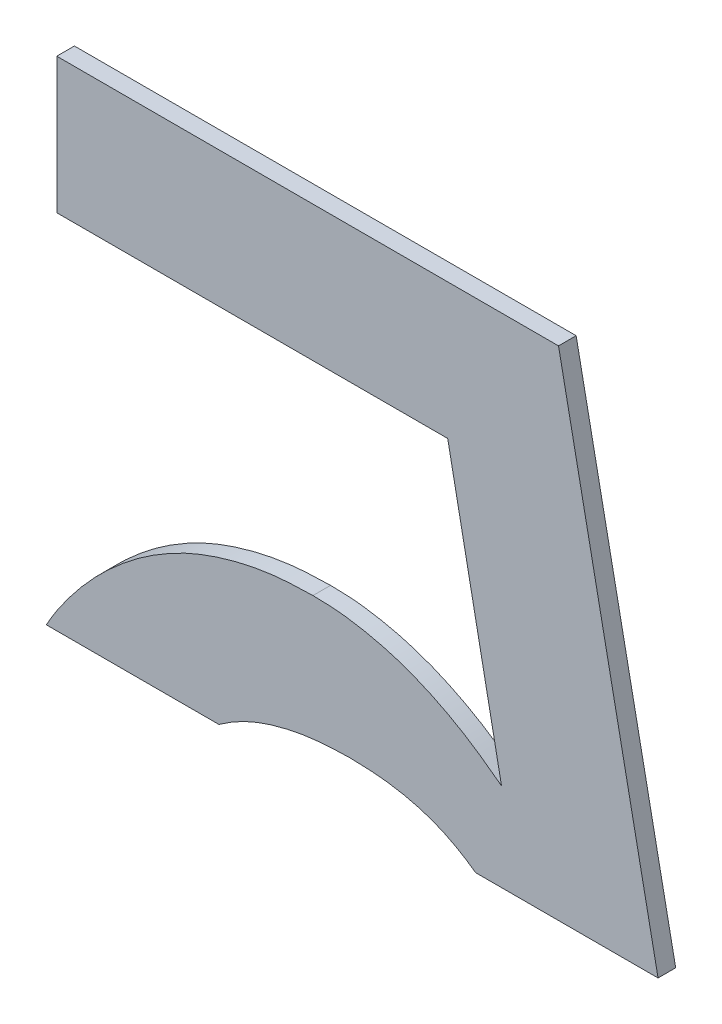
ISO-10303-21;
HEADER;
FILE_DESCRIPTION(('STEP AP214'),'2;1');
FILE_NAME('part.step','',(''),(''),'','','');
FILE_SCHEMA(('AUTOMOTIVE_DESIGN { 1 0 10303 214 1 1 1 1 }'));
ENDSEC;
DATA;
#1=APPLICATION_CONTEXT('core data for automotive mechanical design processes');
#2=APPLICATION_PROTOCOL_DEFINITION('international standard','automotive_design',2000,#1);
#3=PRODUCT_CONTEXT('',#1,'mechanical');
#4=PRODUCT('Part','Part','',(#3));
#5=PRODUCT_RELATED_PRODUCT_CATEGORY('part','',(#4));
#6=PRODUCT_DEFINITION_FORMATION('','',#4);
#7=PRODUCT_DEFINITION_CONTEXT('part definition',#1,'design');
#8=PRODUCT_DEFINITION('design','',#6,#7);
#9=PRODUCT_DEFINITION_SHAPE('','',#8);
#10=(LENGTH_UNIT() NAMED_UNIT(*) SI_UNIT(.MILLI.,.METRE.));
#11=(NAMED_UNIT(*) PLANE_ANGLE_UNIT() SI_UNIT($,.RADIAN.));
#12=(NAMED_UNIT(*) SI_UNIT($,.STERADIAN.) SOLID_ANGLE_UNIT());
#13=UNCERTAINTY_MEASURE_WITH_UNIT(LENGTH_MEASURE(1.E-05),#10,'distance_accuracy_value','');
#14=(GEOMETRIC_REPRESENTATION_CONTEXT(3) GLOBAL_UNCERTAINTY_ASSIGNED_CONTEXT((#13)) GLOBAL_UNIT_ASSIGNED_CONTEXT((#10,
#11,#12)) REPRESENTATION_CONTEXT('',''));
#15=CARTESIAN_POINT('',(0.,0.,0.));
#16=DIRECTION('',(0.,0.,1.));
#17=DIRECTION('',(1.,0.,0.));
#18=AXIS2_PLACEMENT_3D('',#15,#16,#17);
#19=CARTESIAN_POINT('',(-5.76923076923075,-4.93990384615385,0.5));
#20=CARTESIAN_POINT('',(-5.76481556671325,-4.69534295230196,0.5));
#21=CARTESIAN_POINT('',(-5.75621814341022,-4.21912617187611,0.5));
#22=CARTESIAN_POINT('',(-5.68381381272763,-3.52567536035832,0.5));
#23=CARTESIAN_POINT('',(-5.56165918279042,-2.87362173974889,0.5));
#24=CARTESIAN_POINT('',(-5.40360252933254,-2.25577854103315,0.5));
#25=CARTESIAN_POINT('',(-5.18574136819858,-1.68180032511622,0.5));
#26=CARTESIAN_POINT('',(-4.92734576377249,-1.14336496905831,0.5));
#27=CARTESIAN_POINT('',(-4.61080028837524,-0.651899656303548,0.5));
#28=CARTESIAN_POINT('',(-4.25862255894378,-0.192101936840787,0.5));
#29=CARTESIAN_POINT('',(-3.85639112961883,0.220088191438074,0.5));
#30=CARTESIAN_POINT('',(-3.39867192137992,0.568130547046922,0.5));
#31=CARTESIAN_POINT('',(-2.9034209885128,0.872737896042509,0.5));
#32=CARTESIAN_POINT('',(-2.3606634698756,1.11975545357985,0.5));
#33=CARTESIAN_POINT('',(-1.77007976351094,1.30328021662253,0.5));
#34=CARTESIAN_POINT('',(-1.13753864408726,1.44448600800401,0.5));
#35=CARTESIAN_POINT('',(-0.456476560536233,1.51875447221429,0.5));
#36=CARTESIAN_POINT('',(0.0118653544143888,1.53177450360067,0.5));
#37=CARTESIAN_POINT('',(0.252403846153862,1.53846153846154,0.5));
#38=B_SPLINE_CURVE_WITH_KNOTS('',3,(#19,#20,#21,#22,#23,#24,#25,#26,#27,#28,#29,#30,#31,#32,#33,
#34,#35,#36,#37),.UNSPECIFIED.,.F.,.F.,(4,1,1,1,1,1,1,1,1,1,1,1,1,1,1,1,4),(0.,
0.0728659334565352,0.141886871964126,0.207452626414711,0.270437680000097,0.331640872247669,
0.390107577493158,0.448069286948836,0.505502951924537,0.562488152833724,0.619084328884729,
0.676415530692239,0.735452360450793,0.796240769448678,0.860405678089203,0.928304927285106,1.),.UNSPECIFIED.);
#39=DIRECTION('',(0.,0.,-1.));
#40=VECTOR('',#39,1.);
#41=SURFACE_OF_LINEAR_EXTRUSION('',#38,#40);
#42=CARTESIAN_POINT('',(-3.47966020913503,0.500000002167179,0.5));
#43=VERTEX_POINT('',#42);
#44=CARTESIAN_POINT('',(0.252403846153862,1.53846153846154,0.5));
#45=VERTEX_POINT('',#44);
#46=EDGE_CURVE('E169',#43,#45,#38,.T.);
#47=ORIENTED_EDGE('',*,*,#46,.F.);
#48=DIRECTION('',(0.,0.,-1.));
#49=VECTOR('',#48,1.);
#50=CARTESIAN_POINT('',(-3.47966021217343,0.5,0.5));
#51=LINE('',#50,#49);
#52=CARTESIAN_POINT('',(-3.47966021217346,0.5,0.));
#53=VERTEX_POINT('',#52);
#54=EDGE_CURVE('E54',#43,#53,#51,.T.);
#55=ORIENTED_EDGE('',*,*,#54,.T.);
#56=CARTESIAN_POINT('',(-5.76923076923075,-4.93990384615385,0.));
#57=CARTESIAN_POINT('',(-5.76481556671325,-4.69534295230196,0.));
#58=CARTESIAN_POINT('',(-5.75621814341022,-4.21912617187611,0.));
#59=CARTESIAN_POINT('',(-5.68381381272763,-3.52567536035832,0.));
#60=CARTESIAN_POINT('',(-5.56165918279042,-2.87362173974889,0.));
#61=CARTESIAN_POINT('',(-5.40360252933254,-2.25577854103315,0.));
#62=CARTESIAN_POINT('',(-5.18574136819858,-1.68180032511622,0.));
#63=CARTESIAN_POINT('',(-4.92734576377249,-1.14336496905831,0.));
#64=CARTESIAN_POINT('',(-4.61080028837524,-0.651899656303548,0.));
#65=CARTESIAN_POINT('',(-4.25862255894378,-0.192101936840787,0.));
#66=CARTESIAN_POINT('',(-3.85639112961883,0.220088191438074,0.));
#67=CARTESIAN_POINT('',(-3.39867192137992,0.568130547046922,0.));
#68=CARTESIAN_POINT('',(-2.9034209885128,0.872737896042509,0.));
#69=CARTESIAN_POINT('',(-2.3606634698756,1.11975545357985,0.));
#70=CARTESIAN_POINT('',(-1.77007976351094,1.30328021662253,0.));
#71=CARTESIAN_POINT('',(-1.13753864408726,1.44448600800401,0.));
#72=CARTESIAN_POINT('',(-0.456476560536233,1.51875447221429,0.));
#73=CARTESIAN_POINT('',(0.0118653544143888,1.53177450360067,0.));
#74=CARTESIAN_POINT('',(0.252403846153862,1.53846153846154,0.));
#75=B_SPLINE_CURVE_WITH_KNOTS('',3,(#56,#57,#58,#59,#60,#61,#62,#63,#64,#65,#66,#67,#68,#69,#70,
#71,#72,#73,#74),.UNSPECIFIED.,.F.,.F.,(4,1,1,1,1,1,1,1,1,1,1,1,1,1,1,1,4),(0.,
0.0728659334565352,0.141886871964126,0.207452626414711,0.270437680000097,0.331640872247669,
0.390107577493158,0.448069286948836,0.505502951924537,0.562488152833724,0.619084328884729,
0.676415530692239,0.735452360450793,0.796240769448678,0.860405678089203,0.928304927285106,1.),.UNSPECIFIED.);
#76=CARTESIAN_POINT('',(0.252403846153862,1.53846153846154,0.));
#77=VERTEX_POINT('',#76);
#78=EDGE_CURVE('E158',#53,#77,#75,.T.);
#79=ORIENTED_EDGE('',*,*,#78,.T.);
#80=DIRECTION('',(0.,0.,-1.));
#81=VECTOR('',#80,1.);
#82=CARTESIAN_POINT('',(0.252403846153862,1.53846153846154,0.5));
#83=LINE('',#82,#81);
#84=EDGE_CURVE('E130',#45,#77,#83,.T.);
#85=ORIENTED_EDGE('',*,*,#84,.F.);
#86=EDGE_LOOP('',(#47,#55,#79,#85));
#87=FACE_BOUND('',#86,.T.);
#88=ADVANCED_FACE('F39',(#87),#41,.F.);
#89=CARTESIAN_POINT('',(0.252403846153862,1.53846153846154,0.5));
#90=CARTESIAN_POINT('',(0.551501787921143,1.52971233904579,0.5));
#91=CARTESIAN_POINT('',(1.12510395300073,1.51293335455016,0.5));
#92=CARTESIAN_POINT('',(1.94931127775644,1.37177777436305,0.5));
#93=CARTESIAN_POINT('',(2.6996170459154,1.14375891607494,0.5));
#94=CARTESIAN_POINT('',(3.36752632179783,0.803924548647301,0.5));
#95=CARTESIAN_POINT('',(3.96427025562259,0.397936577027731,0.5));
#96=CARTESIAN_POINT('',(4.5022458815372,-0.0614572307281851,0.5));
#97=CARTESIAN_POINT('',(4.98588935496152,-0.573946283867243,0.5));
#98=CARTESIAN_POINT('',(5.2511874903316,-0.959791056380103,0.5));
#99=CARTESIAN_POINT('',(5.3846153846154,-1.15384615384615,0.5));
#100=B_SPLINE_CURVE_WITH_KNOTS('',3,(#89,#90,#91,#92,#93,#94,#95,#96,#97,#98,#99),.UNSPECIFIED.,
.F.,.F.,(4,1,1,1,1,1,1,1,4),(0.,0.147859636731253,0.283561321939548,0.412369396138531,
0.534236355887945,0.652691629311983,0.768663059498123,0.883652401860404,1.),.UNSPECIFIED.);
#101=DIRECTION('',(0.,0.,-1.));
#102=VECTOR('',#101,1.);
#103=SURFACE_OF_LINEAR_EXTRUSION('',#100,#102);
#104=CARTESIAN_POINT('',(0.252403846153862,1.53846153846154,0.));
#105=CARTESIAN_POINT('',(0.551501787921143,1.52971233904579,0.));
#106=CARTESIAN_POINT('',(1.12510395300073,1.51293335455016,0.));
#107=CARTESIAN_POINT('',(1.94931127775644,1.37177777436305,0.));
#108=CARTESIAN_POINT('',(2.6996170459154,1.14375891607494,0.));
#109=CARTESIAN_POINT('',(3.36752632179783,0.803924548647301,0.));
#110=CARTESIAN_POINT('',(3.96427025562259,0.397936577027731,0.));
#111=CARTESIAN_POINT('',(4.5022458815372,-0.0614572307281851,0.));
#112=CARTESIAN_POINT('',(4.98588935496152,-0.573946283867243,0.));
#113=CARTESIAN_POINT('',(5.2511874903316,-0.959791056380103,0.));
#114=CARTESIAN_POINT('',(5.3846153846154,-1.15384615384615,0.));
#115=B_SPLINE_CURVE_WITH_KNOTS('',3,(#104,#105,#106,#107,#108,#109,#110,#111,#112,#113,#114),
.UNSPECIFIED.,.F.,.F.,(4,1,1,1,1,1,1,1,4),(0.,0.147859636731253,0.283561321939548,
0.412369396138531,0.534236355887945,0.652691629311983,0.768663059498123,0.883652401860404,1.),.UNSPECIFIED.);
#116=CARTESIAN_POINT('',(3.80457211909477,0.500000000032833,0.));
#117=VERTEX_POINT('',#116);
#118=EDGE_CURVE('E151',#77,#117,#115,.T.);
#119=ORIENTED_EDGE('',*,*,#118,.T.);
#120=DIRECTION('',(0.,0.,-1.));
#121=VECTOR('',#120,1.);
#122=CARTESIAN_POINT('',(3.80457211914053,0.500000000000002,0.5));
#123=LINE('',#122,#121);
#124=CARTESIAN_POINT('',(3.80457213180867,0.5,0.5));
#125=VERTEX_POINT('',#124);
#126=EDGE_CURVE('E159',#117,#125,#123,.F.);
#127=ORIENTED_EDGE('',*,*,#126,.T.);
#128=EDGE_CURVE('E136',#45,#125,#100,.T.);
#129=ORIENTED_EDGE('',*,*,#128,.F.);
#130=ORIENTED_EDGE('',*,*,#84,.T.);
#131=EDGE_LOOP('',(#119,#127,#129,#130));
#132=FACE_BOUND('',#131,.T.);
#133=ADVANCED_FACE('F184',(#132),#103,.F.);
#134=CARTESIAN_POINT('',(9.23076923076925,-0.76923076923077,0.5));
#135=DIRECTION('',(-0.98058067569092,-0.196116135138184,0.));
#136=DIRECTION('',(0.196116135138184,-0.98058067569092,0.));
#137=AXIS2_PLACEMENT_3D('',#134,#135,#136);
#138=PLANE('',#137);
#139=DIRECTION('',(-0.196116135138184,0.98058067569092,0.));
#140=VECTOR('',#139,1.);
#141=CARTESIAN_POINT('',(9.23076923076925,-0.76923076923077,0.5));
#142=LINE('',#141,#140);
#143=CARTESIAN_POINT('',(8.97692307692309,0.5,0.5));
#144=VERTEX_POINT('',#143);
#145=CARTESIAN_POINT('',(6.15384615384617,14.6153846153846,0.5));
#146=VERTEX_POINT('',#145);
#147=EDGE_CURVE('E133',#144,#146,#142,.T.);
#148=ORIENTED_EDGE('',*,*,#147,.F.);
#149=DIRECTION('',(0.,0.,-1.));
#150=VECTOR('',#149,1.);
#151=CARTESIAN_POINT('',(8.97692307692309,0.5,0.5));
#152=LINE('',#151,#150);
#153=CARTESIAN_POINT('',(8.97692307692309,0.5,0.));
#154=VERTEX_POINT('',#153);
#155=EDGE_CURVE('E120',#144,#154,#152,.T.);
#156=ORIENTED_EDGE('',*,*,#155,.T.);
#157=DIRECTION('',(-0.196116135138184,0.98058067569092,0.));
#158=VECTOR('',#157,1.);
#159=CARTESIAN_POINT('',(9.23076923076925,-0.76923076923077,0.));
#160=LINE('',#159,#158);
#161=CARTESIAN_POINT('',(6.15384615384617,14.6153846153846,0.));
#162=VERTEX_POINT('',#161);
#163=EDGE_CURVE('E128',#154,#162,#160,.T.);
#164=ORIENTED_EDGE('',*,*,#163,.T.);
#165=DIRECTION('',(0.,0.,-1.));
#166=VECTOR('',#165,1.);
#167=CARTESIAN_POINT('',(6.15384615384617,14.6153846153846,0.5));
#168=LINE('',#167,#166);
#169=EDGE_CURVE('E141',#146,#162,#168,.T.);
#170=ORIENTED_EDGE('',*,*,#169,.F.);
#171=EDGE_LOOP('',(#148,#156,#164,#170));
#172=FACE_BOUND('',#171,.T.);
#173=ADVANCED_FACE('F137',(#172),#138,.F.);
#174=CARTESIAN_POINT('',(-0.81129807692306,5.,0.5));
#175=CARTESIAN_POINT('',(-1.1141988645718,4.99206375907898,0.5));
#176=CARTESIAN_POINT('',(-1.71068397645657,4.9764353759689,0.5));
#177=CARTESIAN_POINT('',(-2.58962544260301,4.8480285306234,0.5));
#178=CARTESIAN_POINT('',(-3.43004133811339,4.63004939817371,0.5));
#179=CARTESIAN_POINT('',(-4.2385238149774,4.336463286216,0.5));
#180=CARTESIAN_POINT('',(-5.00441208821668,3.94726474256061,0.5));
#181=CARTESIAN_POINT('',(-5.73546405515526,3.47602794776569,0.5));
#182=CARTESIAN_POINT('',(-6.42872820607369,2.91886862879422,0.5));
#183=CARTESIAN_POINT('',(-7.08028531926996,2.2862992321744,0.5));
#184=CARTESIAN_POINT('',(-7.67127353299072,1.58408070090461,0.5));
#185=CARTESIAN_POINT('',(-8.20022727277801,0.835114931584709,0.5));
#186=CARTESIAN_POINT('',(-8.63224779451468,0.0244096904560783,0.5));
#187=CARTESIAN_POINT('',(-8.99560670429197,-0.826867370101214,0.5));
#188=CARTESIAN_POINT('',(-9.26965977427216,-1.73269027221245,0.5));
#189=CARTESIAN_POINT('',(-9.477675619546,-2.68020353887867,0.5));
#190=CARTESIAN_POINT('',(-9.58889478622745,-3.68125324903562,0.5));
#191=CARTESIAN_POINT('',(-9.60641647528384,-4.36273507459891,0.5));
#192=CARTESIAN_POINT('',(-9.6153846153846,-4.71153846153846,0.5));
#193=B_SPLINE_CURVE_WITH_KNOTS('',3,(#174,#175,#176,#177,#178,#179,#180,#181,#182,#183,#184,
#185,#186,#187,#188,#189,#190,#191,#192),.UNSPECIFIED.,.F.,.F.,(4,1,1,1,1,1,1,1,1,1,1,1,1,1,1,1,
4),(0.,0.061997419075722,0.122087954082293,0.181375310787003,0.239508008395366,
0.297835697896751,0.356879970653118,0.417281825115428,0.479640409079816,0.542500067478357,
0.60496241964819,0.666991033078265,0.730216243010164,0.794172863251256,0.860458143150261,
0.928578179984783,1.),.UNSPECIFIED.);
#194=DIRECTION('',(0.,0.,-1.));
#195=VECTOR('',#194,1.);
#196=SURFACE_OF_LINEAR_EXTRUSION('',#193,#195);
#197=CARTESIAN_POINT('',(-0.81129807692306,5.,0.));
#198=CARTESIAN_POINT('',(-1.1141988645718,4.99206375907898,0.));
#199=CARTESIAN_POINT('',(-1.71068397645657,4.9764353759689,0.));
#200=CARTESIAN_POINT('',(-2.58962544260301,4.8480285306234,0.));
#201=CARTESIAN_POINT('',(-3.43004133811339,4.63004939817371,0.));
#202=CARTESIAN_POINT('',(-4.2385238149774,4.336463286216,0.));
#203=CARTESIAN_POINT('',(-5.00441208821668,3.94726474256061,0.));
#204=CARTESIAN_POINT('',(-5.73546405515526,3.47602794776569,0.));
#205=CARTESIAN_POINT('',(-6.42872820607369,2.91886862879422,0.));
#206=CARTESIAN_POINT('',(-7.08028531926996,2.2862992321744,0.));
#207=CARTESIAN_POINT('',(-7.67127353299072,1.58408070090461,0.));
#208=CARTESIAN_POINT('',(-8.20022727277801,0.835114931584709,0.));
#209=CARTESIAN_POINT('',(-8.63224779451468,0.0244096904560783,0.));
#210=CARTESIAN_POINT('',(-8.99560670429197,-0.826867370101214,0.));
#211=CARTESIAN_POINT('',(-9.26965977427216,-1.73269027221245,0.));
#212=CARTESIAN_POINT('',(-9.477675619546,-2.68020353887867,0.));
#213=CARTESIAN_POINT('',(-9.58889478622745,-3.68125324903562,0.));
#214=CARTESIAN_POINT('',(-9.60641647528384,-4.36273507459891,0.));
#215=CARTESIAN_POINT('',(-9.6153846153846,-4.71153846153846,0.));
#216=B_SPLINE_CURVE_WITH_KNOTS('',3,(#197,#198,#199,#200,#201,#202,#203,#204,#205,#206,#207,
#208,#209,#210,#211,#212,#213,#214,#215),.UNSPECIFIED.,.F.,.F.,(4,1,1,1,1,1,1,1,1,1,1,1,1,1,1,1,
4),(0.,0.061997419075722,0.122087954082293,0.181375310787003,0.239508008395366,
0.297835697896751,0.356879970653118,0.417281825115428,0.479640409079816,0.542500067478357,
0.60496241964819,0.666991033078265,0.730216243010164,0.794172863251256,0.860458143150261,
0.928578179984783,1.),.UNSPECIFIED.);
#217=CARTESIAN_POINT('',(-0.81129807692306,5.,0.));
#218=VERTEX_POINT('',#217);
#219=CARTESIAN_POINT('',(-8.37152514398561,0.5,-1.2E-05));
#220=VERTEX_POINT('',#219);
#221=EDGE_CURVE('E155',#218,#220,#216,.T.);
#222=ORIENTED_EDGE('',*,*,#221,.T.);
#223=DIRECTION('',(0.,0.,-1.));
#224=VECTOR('',#223,1.);
#225=CARTESIAN_POINT('',(-8.37342391002249,0.5,0.5));
#226=LINE('',#225,#224);
#227=CARTESIAN_POINT('',(-8.37342390921078,0.5,0.5));
#228=VERTEX_POINT('',#227);
#229=EDGE_CURVE('E200',#220,#228,#226,.F.);
#230=ORIENTED_EDGE('',*,*,#229,.T.);
#231=CARTESIAN_POINT('',(-0.81129807692306,5.,0.5));
#232=VERTEX_POINT('',#231);
#233=EDGE_CURVE('E162',#232,#228,#193,.T.);
#234=ORIENTED_EDGE('',*,*,#233,.F.);
#235=DIRECTION('',(0.,0.,-1.));
#236=VECTOR('',#235,1.);
#237=CARTESIAN_POINT('',(-0.81129807692306,5.,0.5));
#238=LINE('',#237,#236);
#239=EDGE_CURVE('E170',#232,#218,#238,.T.);
#240=ORIENTED_EDGE('',*,*,#239,.T.);
#241=EDGE_LOOP('',(#222,#230,#234,#240));
#242=FACE_BOUND('',#241,.T.);
#243=ADVANCED_FACE('F177',(#242),#196,.F.);
#244=CARTESIAN_POINT('',(6.72479436320556,-13.1040360063183,0.5));
#245=DIRECTION('',(0.,0.,-1.));
#246=DIRECTION('',(-1.,0.,0.));
#247=AXIS2_PLACEMENT_3D('',#244,#245,#246);
#248=PLANE('',#247);
#249=ORIENTED_EDGE('',*,*,#233,.T.);
#250=DIRECTION('',(1.,0.,0.));
#251=VECTOR('',#250,1.);
#252=CARTESIAN_POINT('',(6.72479436320556,0.5,0.5));
#253=LINE('',#252,#251);
#254=EDGE_CURVE('E138',#228,#43,#253,.T.);
#255=ORIENTED_EDGE('',*,*,#254,.T.);
#256=ORIENTED_EDGE('',*,*,#46,.T.);
#257=ORIENTED_EDGE('',*,*,#128,.T.);
#258=EDGE_CURVE('E123',#125,#144,#253,.T.);
#259=ORIENTED_EDGE('',*,*,#258,.T.);
#260=ORIENTED_EDGE('',*,*,#147,.T.);
#261=DIRECTION('',(-1.,0.,0.));
#262=VECTOR('',#261,1.);
#263=CARTESIAN_POINT('',(6.15384615384617,14.6153846153846,0.5));
#264=LINE('',#263,#262);
#265=CARTESIAN_POINT('',(-8.07692307692306,14.6153846153846,0.5));
#266=VERTEX_POINT('',#265);
#267=EDGE_CURVE('E142',#146,#266,#264,.T.);
#268=ORIENTED_EDGE('',*,*,#267,.T.);
#269=DIRECTION('',(0.,-1.,0.));
#270=VECTOR('',#269,1.);
#271=CARTESIAN_POINT('',(-8.07692307692306,14.6153846153846,0.5));
#272=LINE('',#271,#270);
#273=CARTESIAN_POINT('',(-8.07692307692306,10.7692307692308,0.5));
#274=VERTEX_POINT('',#273);
#275=EDGE_CURVE('E144',#266,#274,#272,.T.);
#276=ORIENTED_EDGE('',*,*,#275,.T.);
#277=DIRECTION('',(1.,0.,0.));
#278=VECTOR('',#277,1.);
#279=CARTESIAN_POINT('',(-8.07692307692306,10.7692307692308,0.5));
#280=LINE('',#279,#278);
#281=CARTESIAN_POINT('',(3.01081730769232,10.7692307692308,0.5));
#282=VERTEX_POINT('',#281);
#283=EDGE_CURVE('E203',#274,#282,#280,.T.);
#284=ORIENTED_EDGE('',*,*,#283,.T.);
#285=DIRECTION('',(0.192758352188409,-0.981246257400052,0.));
#286=VECTOR('',#285,1.);
#287=CARTESIAN_POINT('',(3.01081730769232,10.7692307692308,0.5));
#288=LINE('',#287,#286);
#289=CARTESIAN_POINT('',(4.53725961538463,2.99879807692307,0.5));
#290=VERTEX_POINT('',#289);
#291=EDGE_CURVE('E209',#282,#290,#288,.T.);
#292=ORIENTED_EDGE('',*,*,#291,.T.);
#293=CARTESIAN_POINT('',(4.53725961538463,2.99879807692307,0.5));
#294=CARTESIAN_POINT('',(4.32503914641822,3.158051291402,0.5));
#295=CARTESIAN_POINT('',(3.90827171534036,3.47079941326096,0.5));
#296=CARTESIAN_POINT('',(3.25818922591682,3.88030185449743,0.5));
#297=CARTESIAN_POINT('',(2.59881123895919,4.22548510648211,0.5));
#298=CARTESIAN_POINT('',(1.93397616165271,4.50816116325456,0.5));
#299=CARTESIAN_POINT('',(1.25840292274395,4.72836531422226,0.5));
#300=CARTESIAN_POINT('',(0.576168243883919,4.88135299002355,0.5));
#301=CARTESIAN_POINT('',(-0.115050769355507,4.98475106338591,0.5));
#302=CARTESIAN_POINT('',(-0.578553886176296,4.99490252763146,0.5));
#303=CARTESIAN_POINT('',(-0.81129807692306,5.,0.5));
#304=B_SPLINE_CURVE_WITH_KNOTS('',3,(#293,#294,#295,#296,#297,#298,#299,#300,#301,#302,#303),
.UNSPECIFIED.,.F.,.F.,(4,1,1,1,1,1,1,1,4),(0.,0.136729401859573,0.26851491679083,
0.395529404684809,0.519999953565813,0.64049647684127,0.761236101762532,0.880106717175953,1.),.UNSPECIFIED.);
#305=EDGE_CURVE('E206',#290,#232,#304,.T.);
#306=ORIENTED_EDGE('',*,*,#305,.T.);
#307=EDGE_LOOP('',(#249,#255,#256,#257,#259,#260,#268,#276,#284,#292,#306));
#308=FACE_BOUND('',#307,.T.);
#309=ADVANCED_FACE('F135',(#308),#248,.F.);
#310=CARTESIAN_POINT('',(6.15384615384617,14.6153846153846,0.5));
#311=DIRECTION('',(0.,-1.,0.));
#312=DIRECTION('',(0.,0.,-1.));
#313=AXIS2_PLACEMENT_3D('',#310,#311,#312);
#314=PLANE('',#313);
#315=DIRECTION('',(-1.,0.,0.));
#316=VECTOR('',#315,1.);
#317=CARTESIAN_POINT('',(6.15384615384617,14.6153846153846,0.));
#318=LINE('',#317,#316);
#319=CARTESIAN_POINT('',(-8.07692307692306,14.6153846153846,0.));
#320=VERTEX_POINT('',#319);
#321=EDGE_CURVE('E215',#162,#320,#318,.T.);
#322=ORIENTED_EDGE('',*,*,#321,.T.);
#323=DIRECTION('',(0.,0.,-1.));
#324=VECTOR('',#323,1.);
#325=CARTESIAN_POINT('',(-8.07692307692306,14.6153846153846,0.5));
#326=LINE('',#325,#324);
#327=EDGE_CURVE('E491',#266,#320,#326,.T.);
#328=ORIENTED_EDGE('',*,*,#327,.F.);
#329=ORIENTED_EDGE('',*,*,#267,.F.);
#330=ORIENTED_EDGE('',*,*,#169,.T.);
#331=EDGE_LOOP('',(#322,#328,#329,#330));
#332=FACE_BOUND('',#331,.T.);
#333=ADVANCED_FACE('F252',(#332),#314,.F.);
#334=CARTESIAN_POINT('',(-8.07692307692306,14.6153846153846,0.5));
#335=DIRECTION('',(1.,0.,0.));
#336=DIRECTION('',(0.,0.,-1.));
#337=AXIS2_PLACEMENT_3D('',#334,#335,#336);
#338=PLANE('',#337);
#339=DIRECTION('',(0.,-1.,0.));
#340=VECTOR('',#339,1.);
#341=CARTESIAN_POINT('',(-8.07692307692306,14.6153846153846,0.));
#342=LINE('',#341,#340);
#343=CARTESIAN_POINT('',(-8.07692307692306,10.7692307692308,0.));
#344=VERTEX_POINT('',#343);
#345=EDGE_CURVE('E495',#320,#344,#342,.T.);
#346=ORIENTED_EDGE('',*,*,#345,.T.);
#347=DIRECTION('',(0.,0.,-1.));
#348=VECTOR('',#347,1.);
#349=CARTESIAN_POINT('',(-8.07692307692306,10.7692307692308,0.5));
#350=LINE('',#349,#348);
#351=EDGE_CURVE('E489',#274,#344,#350,.T.);
#352=ORIENTED_EDGE('',*,*,#351,.F.);
#353=ORIENTED_EDGE('',*,*,#275,.F.);
#354=ORIENTED_EDGE('',*,*,#327,.T.);
#355=EDGE_LOOP('',(#346,#352,#353,#354));
#356=FACE_BOUND('',#355,.T.);
#357=ADVANCED_FACE('F319',(#356),#338,.F.);
#358=CARTESIAN_POINT('',(-8.07692307692306,10.7692307692308,0.5));
#359=DIRECTION('',(0.,1.,0.));
#360=DIRECTION('',(0.,0.,1.));
#361=AXIS2_PLACEMENT_3D('',#358,#359,#360);
#362=PLANE('',#361);
#363=DIRECTION('',(1.,0.,0.));
#364=VECTOR('',#363,1.);
#365=CARTESIAN_POINT('',(-8.07692307692306,10.7692307692308,0.));
#366=LINE('',#365,#364);
#367=CARTESIAN_POINT('',(3.01081730769232,10.7692307692308,0.));
#368=VERTEX_POINT('',#367);
#369=EDGE_CURVE('E487',#344,#368,#366,.T.);
#370=ORIENTED_EDGE('',*,*,#369,.T.);
#371=DIRECTION('',(0.,0.,-1.));
#372=VECTOR('',#371,1.);
#373=CARTESIAN_POINT('',(3.01081730769232,10.7692307692308,0.5));
#374=LINE('',#373,#372);
#375=EDGE_CURVE('E477',#282,#368,#374,.T.);
#376=ORIENTED_EDGE('',*,*,#375,.F.);
#377=ORIENTED_EDGE('',*,*,#283,.F.);
#378=ORIENTED_EDGE('',*,*,#351,.T.);
#379=EDGE_LOOP('',(#370,#376,#377,#378));
#380=FACE_BOUND('',#379,.T.);
#381=ADVANCED_FACE('F326',(#380),#362,.F.);
#382=CARTESIAN_POINT('',(3.01081730769232,10.7692307692308,0.5));
#383=DIRECTION('',(0.981246257400052,0.192758352188409,0.));
#384=DIRECTION('',(-0.192758352188409,0.981246257400052,0.));
#385=AXIS2_PLACEMENT_3D('',#382,#383,#384);
#386=PLANE('',#385);
#387=DIRECTION('',(0.192758352188409,-0.981246257400052,0.));
#388=VECTOR('',#387,1.);
#389=CARTESIAN_POINT('',(3.01081730769232,10.7692307692308,0.));
#390=LINE('',#389,#388);
#391=CARTESIAN_POINT('',(4.53725961538463,2.99879807692307,0.));
#392=VERTEX_POINT('',#391);
#393=EDGE_CURVE('E485',#368,#392,#390,.T.);
#394=ORIENTED_EDGE('',*,*,#393,.T.);
#395=DIRECTION('',(0.,0.,-1.));
#396=VECTOR('',#395,1.);
#397=CARTESIAN_POINT('',(4.53725961538463,2.99879807692307,0.5));
#398=LINE('',#397,#396);
#399=EDGE_CURVE('E468',#290,#392,#398,.T.);
#400=ORIENTED_EDGE('',*,*,#399,.F.);
#401=ORIENTED_EDGE('',*,*,#291,.F.);
#402=ORIENTED_EDGE('',*,*,#375,.T.);
#403=EDGE_LOOP('',(#394,#400,#401,#402));
#404=FACE_BOUND('',#403,.T.);
#405=ADVANCED_FACE('F222',(#404),#386,.F.);
#406=DIRECTION('',(0.,0.,-1.));
#407=VECTOR('',#406,1.);
#408=SURFACE_OF_LINEAR_EXTRUSION('',#304,#407);
#409=CARTESIAN_POINT('',(4.53725961538463,2.99879807692307,0.));
#410=CARTESIAN_POINT('',(4.32503914641822,3.158051291402,0.));
#411=CARTESIAN_POINT('',(3.90827171534036,3.47079941326096,0.));
#412=CARTESIAN_POINT('',(3.25818922591682,3.88030185449743,0.));
#413=CARTESIAN_POINT('',(2.59881123895919,4.22548510648211,0.));
#414=CARTESIAN_POINT('',(1.93397616165271,4.50816116325456,0.));
#415=CARTESIAN_POINT('',(1.25840292274395,4.72836531422226,0.));
#416=CARTESIAN_POINT('',(0.576168243883919,4.88135299002355,0.));
#417=CARTESIAN_POINT('',(-0.115050769355507,4.98475106338591,0.));
#418=CARTESIAN_POINT('',(-0.578553886176296,4.99490252763146,0.));
#419=CARTESIAN_POINT('',(-0.81129807692306,5.,0.));
#420=B_SPLINE_CURVE_WITH_KNOTS('',3,(#409,#410,#411,#412,#413,#414,#415,#416,#417,#418,#419),
.UNSPECIFIED.,.F.,.F.,(4,1,1,1,1,1,1,1,4),(0.,0.136729401859573,0.26851491679083,
0.395529404684809,0.519999953565813,0.64049647684127,0.761236101762532,0.880106717175953,1.),.UNSPECIFIED.);
#421=EDGE_CURVE('E475',#392,#218,#420,.T.);
#422=ORIENTED_EDGE('',*,*,#421,.T.);
#423=ORIENTED_EDGE('',*,*,#239,.F.);
#424=ORIENTED_EDGE('',*,*,#305,.F.);
#425=ORIENTED_EDGE('',*,*,#399,.T.);
#426=EDGE_LOOP('',(#422,#423,#424,#425));
#427=FACE_BOUND('',#426,.T.);
#428=ADVANCED_FACE('F217',(#427),#408,.F.);
#429=CARTESIAN_POINT('',(6.72479436320556,-13.1040360063183,0.));
#430=DIRECTION('',(0.,0.,-1.));
#431=DIRECTION('',(-1.,0.,0.));
#432=AXIS2_PLACEMENT_3D('',#429,#430,#431);
#433=PLANE('',#432);
#434=DIRECTION('',(1.,0.,0.));
#435=VECTOR('',#434,1.);
#436=CARTESIAN_POINT('',(6.72479436320556,0.5,0.));
#437=LINE('',#436,#435);
#438=EDGE_CURVE('E11',#220,#53,#437,.T.);
#439=ORIENTED_EDGE('',*,*,#438,.F.);
#440=ORIENTED_EDGE('',*,*,#221,.F.);
#441=ORIENTED_EDGE('',*,*,#421,.F.);
#442=ORIENTED_EDGE('',*,*,#393,.F.);
#443=ORIENTED_EDGE('',*,*,#369,.F.);
#444=ORIENTED_EDGE('',*,*,#345,.F.);
#445=ORIENTED_EDGE('',*,*,#321,.F.);
#446=ORIENTED_EDGE('',*,*,#163,.F.);
#447=DIRECTION('',(1.,0.,0.));
#448=VECTOR('',#447,1.);
#449=CARTESIAN_POINT('',(6.72479436320556,0.5,0.));
#450=LINE('',#449,#448);
#451=EDGE_CURVE('E47',#117,#154,#450,.T.);
#452=ORIENTED_EDGE('',*,*,#451,.F.);
#453=ORIENTED_EDGE('',*,*,#118,.F.);
#454=ORIENTED_EDGE('',*,*,#78,.F.);
#455=EDGE_LOOP('',(#439,#440,#441,#442,#443,#444,#445,#446,#452,#453,#454));
#456=FACE_BOUND('',#455,.T.);
#457=ADVANCED_FACE('F41',(#456),#433,.T.);
#458=CARTESIAN_POINT('',(-17.,0.5,1.));
#459=DIRECTION('',(0.,1.,0.));
#460=DIRECTION('',(0.,0.,1.));
#461=AXIS2_PLACEMENT_3D('',#458,#459,#460);
#462=PLANE('',#461);
#463=ORIENTED_EDGE('',*,*,#451,.T.);
#464=ORIENTED_EDGE('',*,*,#155,.F.);
#465=ORIENTED_EDGE('',*,*,#258,.F.);
#466=ORIENTED_EDGE('',*,*,#126,.F.);
#467=EDGE_LOOP('',(#463,#464,#465,#466));
#468=FACE_BOUND('',#467,.T.);
#469=ADVANCED_FACE('F118',(#468),#462,.F.);
#470=ORIENTED_EDGE('',*,*,#254,.F.);
#471=ORIENTED_EDGE('',*,*,#229,.F.);
#472=ORIENTED_EDGE('',*,*,#438,.T.);
#473=ORIENTED_EDGE('',*,*,#54,.F.);
#474=EDGE_LOOP('',(#470,#471,#472,#473));
#475=FACE_BOUND('',#474,.T.);
#476=ADVANCED_FACE('F230',(#475),#462,.F.);
#477=CLOSED_SHELL('',(#88,#133,#173,#243,#309,#333,#357,#381,#405,#428,#457,#469,#476));
#478=MANIFOLD_SOLID_BREP('B2',#477);
#479=ADVANCED_BREP_SHAPE_REPRESENTATION('',(#18,#478),#14);
#480=SHAPE_DEFINITION_REPRESENTATION(#9,#479);
ENDSEC;
END-ISO-10303-21;
